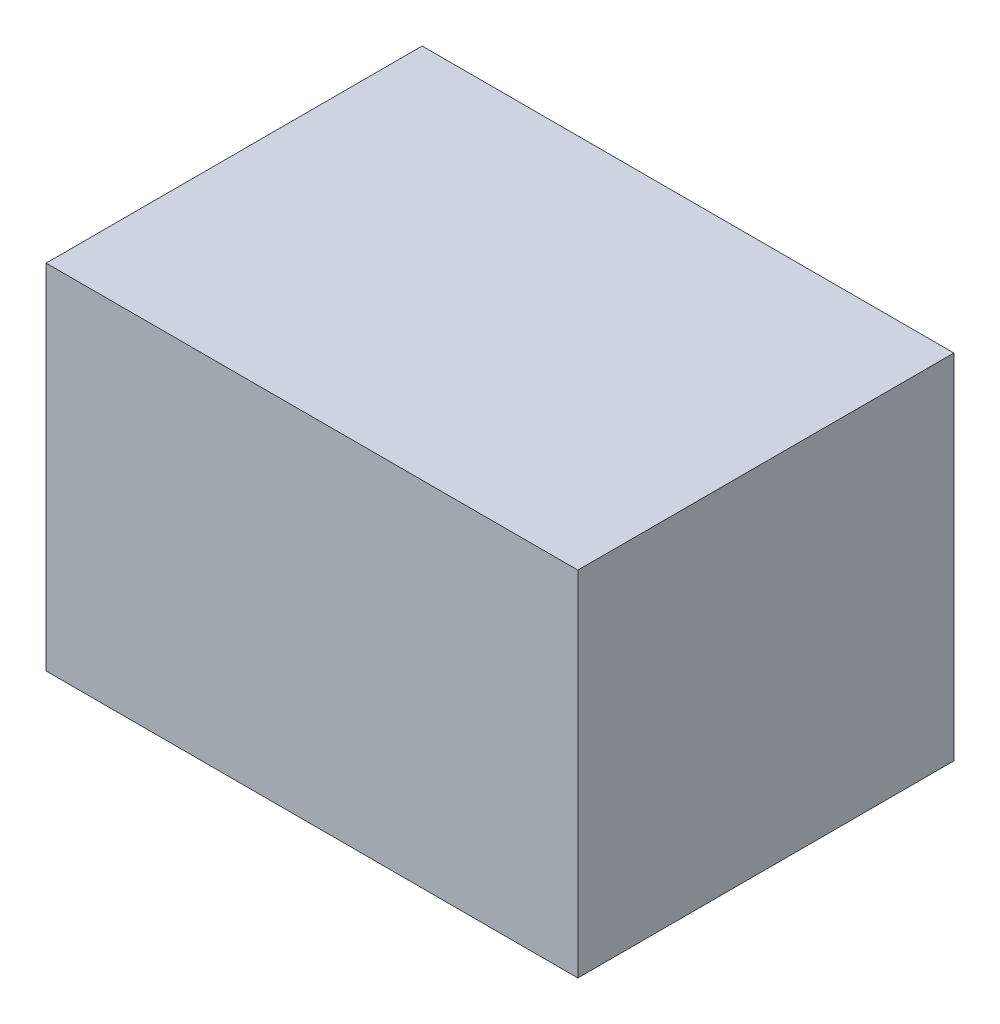
ISO-10303-21;
HEADER;
FILE_DESCRIPTION(('STEP AP214'),'2;1');
FILE_NAME('part.step','',(''),(''),'','','');
FILE_SCHEMA(('AUTOMOTIVE_DESIGN { 1 0 10303 214 1 1 1 1 }'));
ENDSEC;
DATA;
#1=APPLICATION_CONTEXT('core data for automotive mechanical design processes');
#2=APPLICATION_PROTOCOL_DEFINITION('international standard','automotive_design',2000,#1);
#3=PRODUCT_CONTEXT('',#1,'mechanical');
#4=PRODUCT('Part','Part','',(#3));
#5=PRODUCT_RELATED_PRODUCT_CATEGORY('part','',(#4));
#6=PRODUCT_DEFINITION_FORMATION('','',#4);
#7=PRODUCT_DEFINITION_CONTEXT('part definition',#1,'design');
#8=PRODUCT_DEFINITION('design','',#6,#7);
#9=PRODUCT_DEFINITION_SHAPE('','',#8);
#10=(LENGTH_UNIT() NAMED_UNIT(*) SI_UNIT(.MILLI.,.METRE.));
#11=(NAMED_UNIT(*) PLANE_ANGLE_UNIT() SI_UNIT($,.RADIAN.));
#12=(NAMED_UNIT(*) SI_UNIT($,.STERADIAN.) SOLID_ANGLE_UNIT());
#13=UNCERTAINTY_MEASURE_WITH_UNIT(LENGTH_MEASURE(1.E-05),#10,'distance_accuracy_value','');
#14=(GEOMETRIC_REPRESENTATION_CONTEXT(3) GLOBAL_UNCERTAINTY_ASSIGNED_CONTEXT((#13)) GLOBAL_UNIT_ASSIGNED_CONTEXT((#10,
#11,#12)) REPRESENTATION_CONTEXT('',''));
#15=CARTESIAN_POINT('',(0.,0.,0.));
#16=DIRECTION('',(0.,0.,1.));
#17=DIRECTION('',(1.,0.,0.));
#18=AXIS2_PLACEMENT_3D('',#15,#16,#17);
#19=CARTESIAN_POINT('',(-712.084337349398,186.,-271.951807228916));
#20=DIRECTION('',(1.,0.,0.));
#21=DIRECTION('',(0.,0.,-1.));
#22=AXIS2_PLACEMENT_3D('',#19,#20,#21);
#23=PLANE('',#22);
#24=DIRECTION('',(0.,0.,1.));
#25=VECTOR('',#24,1.);
#26=CARTESIAN_POINT('',(-712.084337349398,0.,-271.951807228916));
#27=LINE('',#26,#25);
#28=CARTESIAN_POINT('',(-712.084337349398,0.,-271.951807228916));
#29=VERTEX_POINT('',#28);
#30=CARTESIAN_POINT('',(-712.084337349398,0.,-73.9518072289156));
#31=VERTEX_POINT('',#30);
#32=EDGE_CURVE('E113',#29,#31,#27,.T.);
#33=ORIENTED_EDGE('',*,*,#32,.T.);
#34=DIRECTION('',(0.,-1.,0.));
#35=VECTOR('',#34,1.);
#36=CARTESIAN_POINT('',(-712.084337349398,186.,-73.9518072289156));
#37=LINE('',#36,#35);
#38=CARTESIAN_POINT('',(-712.084337349398,186.,-73.9518072289156));
#39=VERTEX_POINT('',#38);
#40=EDGE_CURVE('E11',#39,#31,#37,.T.);
#41=ORIENTED_EDGE('',*,*,#40,.F.);
#42=DIRECTION('',(0.,0.,1.));
#43=VECTOR('',#42,1.);
#44=CARTESIAN_POINT('',(-712.084337349398,186.,-271.951807228916));
#45=LINE('',#44,#43);
#46=CARTESIAN_POINT('',(-712.084337349398,186.,-271.951807228916));
#47=VERTEX_POINT('',#46);
#48=EDGE_CURVE('E97',#47,#39,#45,.T.);
#49=ORIENTED_EDGE('',*,*,#48,.F.);
#50=DIRECTION('',(0.,-1.,0.));
#51=VECTOR('',#50,1.);
#52=CARTESIAN_POINT('',(-712.084337349398,186.,-271.951807228916));
#53=LINE('',#52,#51);
#54=EDGE_CURVE('E109',#47,#29,#53,.T.);
#55=ORIENTED_EDGE('',*,*,#54,.T.);
#56=EDGE_LOOP('',(#33,#41,#49,#55));
#57=FACE_BOUND('',#56,.T.);
#58=ADVANCED_FACE('F45',(#57),#23,.F.);
#59=CARTESIAN_POINT('',(-712.084337349398,186.,-73.9518072289156));
#60=DIRECTION('',(0.,0.,-1.));
#61=DIRECTION('',(-1.,0.,0.));
#62=AXIS2_PLACEMENT_3D('',#59,#60,#61);
#63=PLANE('',#62);
#64=DIRECTION('',(1.,0.,0.));
#65=VECTOR('',#64,1.);
#66=CARTESIAN_POINT('',(-712.084337349398,0.,-73.9518072289156));
#67=LINE('',#66,#65);
#68=CARTESIAN_POINT('',(-432.084337349397,0.,-73.9518072289156));
#69=VERTEX_POINT('',#68);
#70=EDGE_CURVE('E102',#31,#69,#67,.T.);
#71=ORIENTED_EDGE('',*,*,#70,.T.);
#72=DIRECTION('',(0.,-1.,0.));
#73=VECTOR('',#72,1.);
#74=CARTESIAN_POINT('',(-432.084337349397,186.,-73.9518072289156));
#75=LINE('',#74,#73);
#76=CARTESIAN_POINT('',(-432.084337349397,186.,-73.9518072289156));
#77=VERTEX_POINT('',#76);
#78=EDGE_CURVE('E54',#77,#69,#75,.T.);
#79=ORIENTED_EDGE('',*,*,#78,.F.);
#80=DIRECTION('',(1.,0.,0.));
#81=VECTOR('',#80,1.);
#82=CARTESIAN_POINT('',(-712.084337349398,186.,-73.9518072289156));
#83=LINE('',#82,#81);
#84=EDGE_CURVE('E92',#39,#77,#83,.T.);
#85=ORIENTED_EDGE('',*,*,#84,.F.);
#86=ORIENTED_EDGE('',*,*,#40,.T.);
#87=EDGE_LOOP('',(#71,#79,#85,#86));
#88=FACE_BOUND('',#87,.T.);
#89=ADVANCED_FACE('F101',(#88),#63,.F.);
#90=CARTESIAN_POINT('',(-432.084337349398,186.,-271.951807228916));
#91=DIRECTION('',(-1.,0.,0.));
#92=DIRECTION('',(0.,0.,1.));
#93=AXIS2_PLACEMENT_3D('',#90,#91,#92);
#94=PLANE('',#93);
#95=DIRECTION('',(0.,0.,-1.));
#96=VECTOR('',#95,1.);
#97=CARTESIAN_POINT('',(-432.084337349398,0.,-271.951807228916));
#98=LINE('',#97,#96);
#99=CARTESIAN_POINT('',(-432.084337349398,0.,-271.951807228916));
#100=VERTEX_POINT('',#99);
#101=EDGE_CURVE('E79',#69,#100,#98,.T.);
#102=ORIENTED_EDGE('',*,*,#101,.T.);
#103=DIRECTION('',(0.,-1.,0.));
#104=VECTOR('',#103,1.);
#105=CARTESIAN_POINT('',(-432.084337349398,186.,-271.951807228916));
#106=LINE('',#105,#104);
#107=CARTESIAN_POINT('',(-432.084337349398,186.,-271.951807228916));
#108=VERTEX_POINT('',#107);
#109=EDGE_CURVE('E104',#108,#100,#106,.T.);
#110=ORIENTED_EDGE('',*,*,#109,.F.);
#111=DIRECTION('',(0.,0.,-1.));
#112=VECTOR('',#111,1.);
#113=CARTESIAN_POINT('',(-432.084337349398,186.,-271.951807228916));
#114=LINE('',#113,#112);
#115=EDGE_CURVE('E95',#77,#108,#114,.T.);
#116=ORIENTED_EDGE('',*,*,#115,.F.);
#117=ORIENTED_EDGE('',*,*,#78,.T.);
#118=EDGE_LOOP('',(#102,#110,#116,#117));
#119=FACE_BOUND('',#118,.T.);
#120=ADVANCED_FACE('F105',(#119),#94,.F.);
#121=CARTESIAN_POINT('',(-712.084337349398,186.,-271.951807228916));
#122=DIRECTION('',(0.,0.,1.));
#123=DIRECTION('',(1.,0.,0.));
#124=AXIS2_PLACEMENT_3D('',#121,#122,#123);
#125=PLANE('',#124);
#126=DIRECTION('',(-1.,0.,0.));
#127=VECTOR('',#126,1.);
#128=CARTESIAN_POINT('',(-712.084337349398,0.,-271.951807228916));
#129=LINE('',#128,#127);
#130=EDGE_CURVE('E85',#100,#29,#129,.T.);
#131=ORIENTED_EDGE('',*,*,#130,.T.);
#132=ORIENTED_EDGE('',*,*,#54,.F.);
#133=DIRECTION('',(-1.,0.,0.));
#134=VECTOR('',#133,1.);
#135=CARTESIAN_POINT('',(-712.084337349398,186.,-271.951807228916));
#136=LINE('',#135,#134);
#137=EDGE_CURVE('E62',#108,#47,#136,.T.);
#138=ORIENTED_EDGE('',*,*,#137,.F.);
#139=ORIENTED_EDGE('',*,*,#109,.T.);
#140=EDGE_LOOP('',(#131,#132,#138,#139));
#141=FACE_BOUND('',#140,.T.);
#142=ADVANCED_FACE('F126',(#141),#125,.F.);
#143=CARTESIAN_POINT('',(0.,186.,0.));
#144=DIRECTION('',(0.,1.,0.));
#145=DIRECTION('',(0.,0.,1.));
#146=AXIS2_PLACEMENT_3D('',#143,#144,#145);
#147=PLANE('',#146);
#148=ORIENTED_EDGE('',*,*,#48,.T.);
#149=ORIENTED_EDGE('',*,*,#84,.T.);
#150=ORIENTED_EDGE('',*,*,#115,.T.);
#151=ORIENTED_EDGE('',*,*,#137,.T.);
#152=EDGE_LOOP('',(#148,#149,#150,#151));
#153=FACE_BOUND('',#152,.T.);
#154=ADVANCED_FACE('F93',(#153),#147,.T.);
#155=CARTESIAN_POINT('',(0.,0.,0.));
#156=DIRECTION('',(0.,1.,0.));
#157=DIRECTION('',(0.,0.,1.));
#158=AXIS2_PLACEMENT_3D('',#155,#156,#157);
#159=PLANE('',#158);
#160=ORIENTED_EDGE('',*,*,#32,.F.);
#161=ORIENTED_EDGE('',*,*,#130,.F.);
#162=ORIENTED_EDGE('',*,*,#101,.F.);
#163=ORIENTED_EDGE('',*,*,#70,.F.);
#164=EDGE_LOOP('',(#160,#161,#162,#163));
#165=FACE_BOUND('',#164,.T.);
#166=ADVANCED_FACE('F129',(#165),#159,.F.);
#167=CLOSED_SHELL('',(#58,#89,#120,#142,#154,#166));
#168=MANIFOLD_SOLID_BREP('B2',#167);
#169=ADVANCED_BREP_SHAPE_REPRESENTATION('',(#18,#168),#14);
#170=SHAPE_DEFINITION_REPRESENTATION(#9,#169);
ENDSEC;
END-ISO-10303-21;
